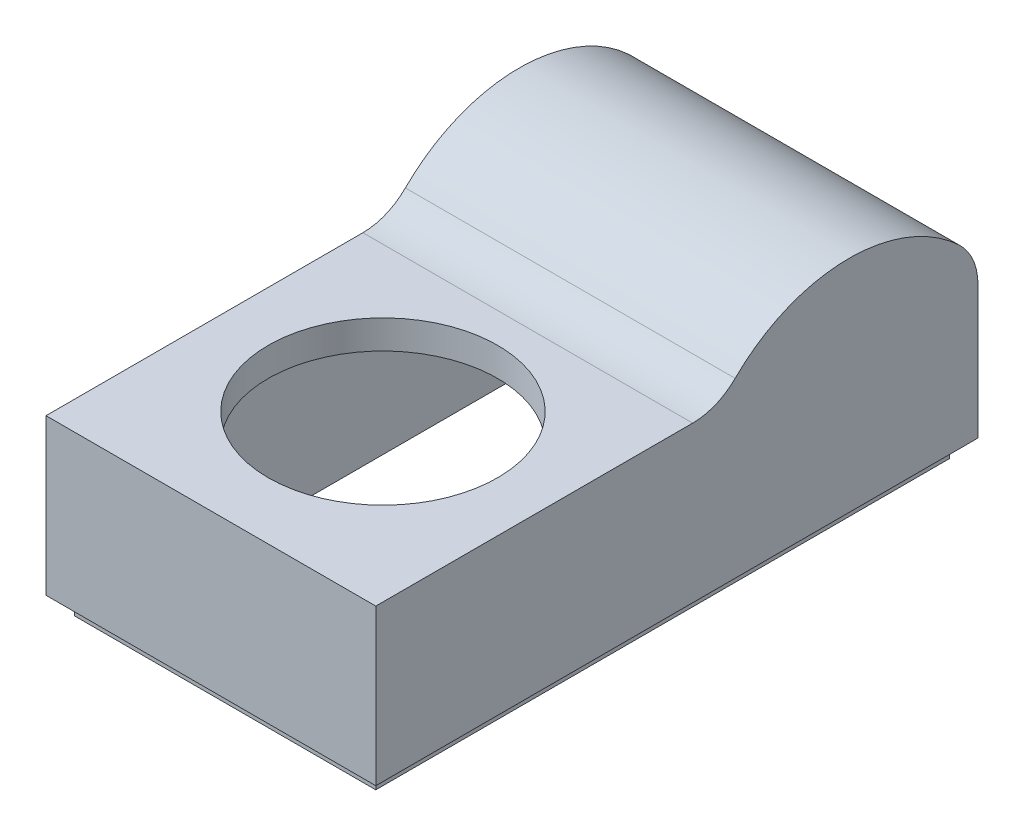
ISO-10303-21;
HEADER;
FILE_DESCRIPTION(('STEP AP214'),'2;1');
FILE_NAME('part.step','',(''),(''),'','','');
FILE_SCHEMA(('AUTOMOTIVE_DESIGN { 1 0 10303 214 1 1 1 1 }'));
ENDSEC;
DATA;
#1=APPLICATION_CONTEXT('core data for automotive mechanical design processes');
#2=APPLICATION_PROTOCOL_DEFINITION('international standard','automotive_design',2000,#1);
#3=PRODUCT_CONTEXT('',#1,'mechanical');
#4=PRODUCT('Part','Part','',(#3));
#5=PRODUCT_RELATED_PRODUCT_CATEGORY('part','',(#4));
#6=PRODUCT_DEFINITION_FORMATION('','',#4);
#7=PRODUCT_DEFINITION_CONTEXT('part definition',#1,'design');
#8=PRODUCT_DEFINITION('design','',#6,#7);
#9=PRODUCT_DEFINITION_SHAPE('','',#8);
#10=(LENGTH_UNIT() NAMED_UNIT(*) SI_UNIT(.MILLI.,.METRE.));
#11=(NAMED_UNIT(*) PLANE_ANGLE_UNIT() SI_UNIT($,.RADIAN.));
#12=(NAMED_UNIT(*) SI_UNIT($,.STERADIAN.) SOLID_ANGLE_UNIT());
#13=UNCERTAINTY_MEASURE_WITH_UNIT(LENGTH_MEASURE(1.E-05),#10,'distance_accuracy_value','');
#14=(GEOMETRIC_REPRESENTATION_CONTEXT(3) GLOBAL_UNCERTAINTY_ASSIGNED_CONTEXT((#13)) GLOBAL_UNIT_ASSIGNED_CONTEXT((#10,
#11,#12)) REPRESENTATION_CONTEXT('',''));
#15=CARTESIAN_POINT('',(0.,0.,0.));
#16=DIRECTION('',(0.,0.,1.));
#17=DIRECTION('',(1.,0.,0.));
#18=AXIS2_PLACEMENT_3D('',#15,#16,#17);
#19=CARTESIAN_POINT('',(0.,-9.74725,0.));
#20=DIRECTION('',(0.,1.,0.));
#21=DIRECTION('',(0.,0.,1.));
#22=AXIS2_PLACEMENT_3D('',#19,#20,#21);
#23=PLANE('',#22);
#24=DIRECTION('',(1.,0.,0.));
#25=VECTOR('',#24,1.);
#26=CARTESIAN_POINT('',(-13.335,-9.74725,-25.4));
#27=LINE('',#26,#25);
#28=CARTESIAN_POINT('',(-13.335,-9.74725,-25.4));
#29=VERTEX_POINT('',#28);
#30=CARTESIAN_POINT('',(-5.39750000000001,-9.74725,-25.4));
#31=VERTEX_POINT('',#30);
#32=EDGE_CURVE('E49',#29,#31,#27,.T.);
#33=ORIENTED_EDGE('',*,*,#32,.F.);
#34=DIRECTION('',(0.,0.,-1.));
#35=VECTOR('',#34,1.);
#36=CARTESIAN_POINT('',(-13.335,-9.74725,25.4));
#37=LINE('',#36,#35);
#38=CARTESIAN_POINT('',(-13.335,-9.74725,25.4));
#39=VERTEX_POINT('',#38);
#40=EDGE_CURVE('E53',#39,#29,#37,.T.);
#41=ORIENTED_EDGE('',*,*,#40,.F.);
#42=DIRECTION('',(-1.,0.,0.));
#43=VECTOR('',#42,1.);
#44=CARTESIAN_POINT('',(13.335,-9.74725,25.4));
#45=LINE('',#44,#43);
#46=CARTESIAN_POINT('',(13.335,-9.74725,25.4));
#47=VERTEX_POINT('',#46);
#48=EDGE_CURVE('E251',#47,#39,#45,.T.);
#49=ORIENTED_EDGE('',*,*,#48,.F.);
#50=DIRECTION('',(0.,0.,1.));
#51=VECTOR('',#50,1.);
#52=CARTESIAN_POINT('',(13.335,-9.74725,-25.4));
#53=LINE('',#52,#51);
#54=CARTESIAN_POINT('',(13.335,-9.74725,-25.4));
#55=VERTEX_POINT('',#54);
#56=EDGE_CURVE('E248',#55,#47,#53,.T.);
#57=ORIENTED_EDGE('',*,*,#56,.F.);
#58=DIRECTION('',(1.,0.,0.));
#59=VECTOR('',#58,1.);
#60=CARTESIAN_POINT('',(5.3975,-9.74725,-25.4));
#61=LINE('',#60,#59);
#62=CARTESIAN_POINT('',(5.39749999999999,-9.74725,-25.4));
#63=VERTEX_POINT('',#62);
#64=EDGE_CURVE('E245',#63,#55,#61,.T.);
#65=ORIENTED_EDGE('',*,*,#64,.F.);
#66=DIRECTION('',(0.,0.,-1.));
#67=VECTOR('',#66,1.);
#68=CARTESIAN_POINT('',(5.3975,-9.74725,-13.2188964238259));
#69=LINE('',#68,#67);
#70=CARTESIAN_POINT('',(5.39749999999999,-9.74725,-26.67));
#71=VERTEX_POINT('',#70);
#72=EDGE_CURVE('E280',#63,#71,#69,.T.);
#73=ORIENTED_EDGE('',*,*,#72,.T.);
#74=DIRECTION('',(-1.,0.,0.));
#75=VECTOR('',#74,1.);
#76=CARTESIAN_POINT('',(-14.605,-9.74725,-26.67));
#77=LINE('',#76,#75);
#78=CARTESIAN_POINT('',(14.605,-9.74725,-26.67));
#79=VERTEX_POINT('',#78);
#80=EDGE_CURVE('E351',#79,#71,#77,.T.);
#81=ORIENTED_EDGE('',*,*,#80,.F.);
#82=DIRECTION('',(0.,0.,-1.));
#83=VECTOR('',#82,1.);
#84=CARTESIAN_POINT('',(14.605,-9.74725,-26.67));
#85=LINE('',#84,#83);
#86=CARTESIAN_POINT('',(14.605,-9.74725,26.67));
#87=VERTEX_POINT('',#86);
#88=EDGE_CURVE('E347',#87,#79,#85,.T.);
#89=ORIENTED_EDGE('',*,*,#88,.F.);
#90=DIRECTION('',(1.,0.,0.));
#91=VECTOR('',#90,1.);
#92=CARTESIAN_POINT('',(-14.605,-9.74725,26.67));
#93=LINE('',#92,#91);
#94=CARTESIAN_POINT('',(-14.605,-9.74725,26.67));
#95=VERTEX_POINT('',#94);
#96=EDGE_CURVE('E344',#95,#87,#93,.T.);
#97=ORIENTED_EDGE('',*,*,#96,.F.);
#98=DIRECTION('',(0.,0.,1.));
#99=VECTOR('',#98,1.);
#100=CARTESIAN_POINT('',(-14.605,-9.74725,-26.67));
#101=LINE('',#100,#99);
#102=CARTESIAN_POINT('',(-14.605,-9.74725,-26.67));
#103=VERTEX_POINT('',#102);
#104=EDGE_CURVE('E341',#103,#95,#101,.T.);
#105=ORIENTED_EDGE('',*,*,#104,.F.);
#106=CARTESIAN_POINT('',(-5.39750000000001,-9.74725,-26.67));
#107=VERTEX_POINT('',#106);
#108=EDGE_CURVE('E350',#107,#103,#77,.T.);
#109=ORIENTED_EDGE('',*,*,#108,.F.);
#110=DIRECTION('',(0.,0.,-1.));
#111=VECTOR('',#110,1.);
#112=CARTESIAN_POINT('',(-5.3975,-9.74725,-13.2188964238259));
#113=LINE('',#112,#111);
#114=EDGE_CURVE('E203',#31,#107,#113,.T.);
#115=ORIENTED_EDGE('',*,*,#114,.F.);
#116=EDGE_LOOP('',(#33,#41,#49,#57,#65,#73,#81,#89,#97,#105,#109,#115));
#117=FACE_BOUND('',#116,.T.);
#118=ADVANCED_FACE('F33',(#117),#23,.F.);
#119=CARTESIAN_POINT('',(-14.605,9.74725,-26.67));
#120=DIRECTION('',(1.,0.,0.));
#121=DIRECTION('',(0.,0.,-1.));
#122=AXIS2_PLACEMENT_3D('',#119,#120,#121);
#123=PLANE('',#122);
#124=CARTESIAN_POINT('',(-14.605,-4.54025,-15.24));
#125=DIRECTION('',(1.,0.,0.));
#126=DIRECTION('',(0.,0.,-1.));
#127=AXIS2_PLACEMENT_3D('',#124,#125,#126);
#128=CIRCLE('',#127,14.2875);
#129=CARTESIAN_POINT('',(-14.605,5.92422779171324,-24.9676595744681));
#130=VERTEX_POINT('',#129);
#131=CARTESIAN_POINT('',(-14.605,5.58584223300971,-5.16056984058223));
#132=VERTEX_POINT('',#131);
#133=EDGE_CURVE('E332',#130,#132,#128,.T.);
#134=ORIENTED_EDGE('',*,*,#133,.F.);
#135=CARTESIAN_POINT('',(-14.605,2.0174894161403,-21.336));
#136=DIRECTION('',(1.,0.,0.));
#137=DIRECTION('',(0.,0.,-1.));
#138=AXIS2_PLACEMENT_3D('',#135,#136,#137);
#139=CIRCLE('',#138,5.334);
#140=CARTESIAN_POINT('',(-14.605,2.0174894161403,-26.67));
#141=VERTEX_POINT('',#140);
#142=EDGE_CURVE('E11',#130,#141,#139,.F.);
#143=ORIENTED_EDGE('',*,*,#142,.T.);
#144=DIRECTION('',(0.,-1.,0.));
#145=VECTOR('',#144,1.);
#146=CARTESIAN_POINT('',(-14.605,9.74725,-26.67));
#147=LINE('',#146,#145);
#148=EDGE_CURVE('E354',#141,#103,#147,.T.);
#149=ORIENTED_EDGE('',*,*,#148,.T.);
#150=ORIENTED_EDGE('',*,*,#104,.T.);
#151=DIRECTION('',(0.,-1.,0.));
#152=VECTOR('',#151,1.);
#153=CARTESIAN_POINT('',(-14.605,9.74725,26.67));
#154=LINE('',#153,#152);
#155=CARTESIAN_POINT('',(-14.605,4.03225,26.67));
#156=VERTEX_POINT('',#155);
#157=EDGE_CURVE('E361',#156,#95,#154,.T.);
#158=ORIENTED_EDGE('',*,*,#157,.F.);
#159=DIRECTION('',(0.,0.,1.));
#160=VECTOR('',#159,1.);
#161=CARTESIAN_POINT('',(-14.605,4.03225,0.));
#162=LINE('',#161,#160);
#163=CARTESIAN_POINT('',(-14.605,4.03225,-1.39758258106627));
#164=VERTEX_POINT('',#163);
#165=EDGE_CURVE('E330',#164,#156,#162,.T.);
#166=ORIENTED_EDGE('',*,*,#165,.F.);
#167=CARTESIAN_POINT('',(-14.605,9.36625,-1.39758258106627));
#168=DIRECTION('',(1.,0.,0.));
#169=DIRECTION('',(0.,0.,-1.));
#170=AXIS2_PLACEMENT_3D('',#167,#168,#169);
#171=CIRCLE('',#170,5.334);
#172=EDGE_CURVE('E370',#164,#132,#171,.T.);
#173=ORIENTED_EDGE('',*,*,#172,.T.);
#174=EDGE_LOOP('',(#134,#143,#149,#150,#158,#166,#173));
#175=FACE_BOUND('',#174,.T.);
#176=ADVANCED_FACE('F386',(#175),#123,.F.);
#177=CARTESIAN_POINT('',(14.605,9.74725,-26.67));
#178=DIRECTION('',(-1.,0.,0.));
#179=DIRECTION('',(0.,0.,1.));
#180=AXIS2_PLACEMENT_3D('',#177,#178,#179);
#181=PLANE('',#180);
#182=DIRECTION('',(0.,-1.,0.));
#183=VECTOR('',#182,1.);
#184=CARTESIAN_POINT('',(14.605,9.74725,-26.67));
#185=LINE('',#184,#183);
#186=CARTESIAN_POINT('',(14.605,2.0174894161403,-26.67));
#187=VERTEX_POINT('',#186);
#188=EDGE_CURVE('E357',#187,#79,#185,.T.);
#189=ORIENTED_EDGE('',*,*,#188,.F.);
#190=CARTESIAN_POINT('',(14.605,2.0174894161403,-21.336));
#191=DIRECTION('',(-1.,0.,0.));
#192=DIRECTION('',(0.,0.,1.));
#193=AXIS2_PLACEMENT_3D('',#190,#191,#192);
#194=CIRCLE('',#193,5.334);
#195=CARTESIAN_POINT('',(14.605,5.92422779171324,-24.9676595744681));
#196=VERTEX_POINT('',#195);
#197=EDGE_CURVE('E376',#187,#196,#194,.F.);
#198=ORIENTED_EDGE('',*,*,#197,.T.);
#199=CARTESIAN_POINT('',(14.605,-4.54025,-15.24));
#200=DIRECTION('',(1.,0.,0.));
#201=DIRECTION('',(0.,0.,-1.));
#202=AXIS2_PLACEMENT_3D('',#199,#200,#201);
#203=CIRCLE('',#202,14.2875);
#204=CARTESIAN_POINT('',(14.605,5.58584223300971,-5.16056984058224));
#205=VERTEX_POINT('',#204);
#206=EDGE_CURVE('E336',#205,#196,#203,.F.);
#207=ORIENTED_EDGE('',*,*,#206,.F.);
#208=CARTESIAN_POINT('',(14.605,9.36625,-1.39758258106627));
#209=DIRECTION('',(-1.,0.,0.));
#210=DIRECTION('',(0.,0.,1.));
#211=AXIS2_PLACEMENT_3D('',#208,#209,#210);
#212=CIRCLE('',#211,5.334);
#213=CARTESIAN_POINT('',(14.605,4.03225,-1.39758258106627));
#214=VERTEX_POINT('',#213);
#215=EDGE_CURVE('E368',#205,#214,#212,.T.);
#216=ORIENTED_EDGE('',*,*,#215,.T.);
#217=DIRECTION('',(0.,0.,-1.));
#218=VECTOR('',#217,1.);
#219=CARTESIAN_POINT('',(14.605,4.03225,0.));
#220=LINE('',#219,#218);
#221=CARTESIAN_POINT('',(14.605,4.03225,26.67));
#222=VERTEX_POINT('',#221);
#223=EDGE_CURVE('E296',#222,#214,#220,.T.);
#224=ORIENTED_EDGE('',*,*,#223,.F.);
#225=DIRECTION('',(0.,-1.,0.));
#226=VECTOR('',#225,1.);
#227=CARTESIAN_POINT('',(14.605,9.74725,26.67));
#228=LINE('',#227,#226);
#229=EDGE_CURVE('E359',#222,#87,#228,.T.);
#230=ORIENTED_EDGE('',*,*,#229,.T.);
#231=ORIENTED_EDGE('',*,*,#88,.T.);
#232=EDGE_LOOP('',(#189,#198,#207,#216,#224,#230,#231));
#233=FACE_BOUND('',#232,.T.);
#234=ADVANCED_FACE('F397',(#233),#181,.F.);
#235=CARTESIAN_POINT('',(-14.605,9.74725,26.67));
#236=DIRECTION('',(0.,0.,-1.));
#237=DIRECTION('',(-1.,0.,0.));
#238=AXIS2_PLACEMENT_3D('',#235,#236,#237);
#239=PLANE('',#238);
#240=ORIENTED_EDGE('',*,*,#229,.F.);
#241=DIRECTION('',(1.,0.,0.));
#242=VECTOR('',#241,1.);
#243=CARTESIAN_POINT('',(-56.9028643077875,4.03225,26.67));
#244=LINE('',#243,#242);
#245=EDGE_CURVE('E333',#156,#222,#244,.T.);
#246=ORIENTED_EDGE('',*,*,#245,.F.);
#247=ORIENTED_EDGE('',*,*,#157,.T.);
#248=ORIENTED_EDGE('',*,*,#96,.T.);
#249=EDGE_LOOP('',(#240,#246,#247,#248));
#250=FACE_BOUND('',#249,.T.);
#251=ADVANCED_FACE('F418',(#250),#239,.F.);
#252=CARTESIAN_POINT('',(-14.605,9.74725,-26.67));
#253=DIRECTION('',(0.,0.,1.));
#254=DIRECTION('',(1.,0.,0.));
#255=AXIS2_PLACEMENT_3D('',#252,#253,#254);
#256=PLANE('',#255);
#257=DIRECTION('',(1.,0.,0.));
#258=VECTOR('',#257,1.);
#259=CARTESIAN_POINT('',(5.39749999999999,-8.15975,-26.67));
#260=LINE('',#259,#258);
#261=CARTESIAN_POINT('',(-5.39750000000001,-8.15975,-26.67));
#262=VERTEX_POINT('',#261);
#263=CARTESIAN_POINT('',(5.39749999999999,-8.15975,-26.67));
#264=VERTEX_POINT('',#263);
#265=EDGE_CURVE('E271',#262,#264,#260,.T.);
#266=ORIENTED_EDGE('',*,*,#265,.F.);
#267=DIRECTION('',(0.,1.,0.));
#268=VECTOR('',#267,1.);
#269=CARTESIAN_POINT('',(-5.39750000000001,-9.74725,-26.67));
#270=LINE('',#269,#268);
#271=EDGE_CURVE('E274',#107,#262,#270,.T.);
#272=ORIENTED_EDGE('',*,*,#271,.F.);
#273=ORIENTED_EDGE('',*,*,#108,.T.);
#274=ORIENTED_EDGE('',*,*,#148,.F.);
#275=DIRECTION('',(1.,0.,0.));
#276=VECTOR('',#275,1.);
#277=CARTESIAN_POINT('',(-14.605,2.0174894161403,-26.67));
#278=LINE('',#277,#276);
#279=EDGE_CURVE('E373',#141,#187,#278,.T.);
#280=ORIENTED_EDGE('',*,*,#279,.T.);
#281=ORIENTED_EDGE('',*,*,#188,.T.);
#282=ORIENTED_EDGE('',*,*,#80,.T.);
#283=DIRECTION('',(0.,-1.,0.));
#284=VECTOR('',#283,1.);
#285=CARTESIAN_POINT('',(5.39749999999999,-9.74725,-26.67));
#286=LINE('',#285,#284);
#287=EDGE_CURVE('E270',#264,#71,#286,.T.);
#288=ORIENTED_EDGE('',*,*,#287,.F.);
#289=EDGE_LOOP('',(#266,#272,#273,#274,#280,#281,#282,#288));
#290=FACE_BOUND('',#289,.T.);
#291=ADVANCED_FACE('F395',(#290),#256,.F.);
#292=CARTESIAN_POINT('',(-56.9028643077875,4.03225,0.));
#293=DIRECTION('',(0.,-1.,0.));
#294=DIRECTION('',(0.,0.,-1.));
#295=AXIS2_PLACEMENT_3D('',#292,#293,#294);
#296=PLANE('',#295);
#297=CARTESIAN_POINT('',(0.,4.03225,11.43));
#298=DIRECTION('',(0.,1.,0.));
#299=DIRECTION('',(0.,0.,1.));
#300=AXIS2_PLACEMENT_3D('',#297,#298,#299);
#301=CIRCLE('',#300,10.16);
#302=CARTESIAN_POINT('',(0.,4.03225,21.59));
#303=VERTEX_POINT('',#302);
#304=EDGE_CURVE('E288',#303,#303,#301,.T.);
#305=ORIENTED_EDGE('',*,*,#304,.F.);
#306=EDGE_LOOP('',(#305));
#307=FACE_BOUND('',#306,.T.);
#308=ORIENTED_EDGE('',*,*,#223,.T.);
#309=DIRECTION('',(-1.,0.,0.));
#310=VECTOR('',#309,1.);
#311=CARTESIAN_POINT('',(-14.605,4.03225,-1.39758258106627));
#312=LINE('',#311,#310);
#313=EDGE_CURVE('E366',#214,#164,#312,.T.);
#314=ORIENTED_EDGE('',*,*,#313,.T.);
#315=ORIENTED_EDGE('',*,*,#165,.T.);
#316=ORIENTED_EDGE('',*,*,#245,.T.);
#317=EDGE_LOOP('',(#308,#314,#315,#316));
#318=FACE_BOUND('',#317,.T.);
#319=ADVANCED_FACE('F420',(#307,#318),#296,.F.);
#320=CARTESIAN_POINT('',(-56.9028643077875,-4.54025,-15.24));
#321=DIRECTION('',(1.,0.,0.));
#322=DIRECTION('',(0.,0.,-1.));
#323=AXIS2_PLACEMENT_3D('',#320,#321,#322);
#324=CYLINDRICAL_SURFACE('',#323,14.2875);
#325=ORIENTED_EDGE('',*,*,#206,.T.);
#326=DIRECTION('',(1.,0.,0.));
#327=VECTOR('',#326,1.);
#328=CARTESIAN_POINT('',(-56.9028643077875,5.92422779171324,-24.9676595744681));
#329=LINE('',#328,#327);
#330=EDGE_CURVE('E42',#196,#130,#329,.F.);
#331=ORIENTED_EDGE('',*,*,#330,.T.);
#332=ORIENTED_EDGE('',*,*,#133,.T.);
#333=DIRECTION('',(1.,0.,0.));
#334=VECTOR('',#333,1.);
#335=CARTESIAN_POINT('',(-56.9028643077875,5.58584223300971,-5.16056984058222));
#336=LINE('',#335,#334);
#337=EDGE_CURVE('E363',#132,#205,#336,.T.);
#338=ORIENTED_EDGE('',*,*,#337,.T.);
#339=EDGE_LOOP('',(#325,#331,#332,#338));
#340=FACE_BOUND('',#339,.T.);
#341=ADVANCED_FACE('F381',(#340),#324,.T.);
#342=CARTESIAN_POINT('',(-56.9028643077875,9.36625,-1.39758258106626));
#343=DIRECTION('',(1.,0.,0.));
#344=DIRECTION('',(0.,0.,-1.));
#345=AXIS2_PLACEMENT_3D('',#342,#343,#344);
#346=CYLINDRICAL_SURFACE('',#345,5.334);
#347=ORIENTED_EDGE('',*,*,#172,.F.);
#348=ORIENTED_EDGE('',*,*,#313,.F.);
#349=ORIENTED_EDGE('',*,*,#215,.F.);
#350=ORIENTED_EDGE('',*,*,#337,.F.);
#351=EDGE_LOOP('',(#347,#348,#349,#350));
#352=FACE_BOUND('',#351,.T.);
#353=ADVANCED_FACE('F423',(#352),#346,.F.);
#354=CARTESIAN_POINT('',(-56.9028643077875,2.0174894161403,-21.336));
#355=DIRECTION('',(1.,0.,0.));
#356=DIRECTION('',(0.,0.,-1.));
#357=AXIS2_PLACEMENT_3D('',#354,#355,#356);
#358=CYLINDRICAL_SURFACE('',#357,5.334);
#359=ORIENTED_EDGE('',*,*,#142,.F.);
#360=ORIENTED_EDGE('',*,*,#330,.F.);
#361=ORIENTED_EDGE('',*,*,#197,.F.);
#362=ORIENTED_EDGE('',*,*,#279,.F.);
#363=EDGE_LOOP('',(#359,#360,#361,#362));
#364=FACE_BOUND('',#363,.T.);
#365=ADVANCED_FACE('F35',(#364),#358,.T.);
#366=CARTESIAN_POINT('',(-12.065,9.74725,-26.67));
#367=DIRECTION('',(1.,0.,0.));
#368=DIRECTION('',(0.,0.,-1.));
#369=AXIS2_PLACEMENT_3D('',#366,#367,#368);
#370=PLANE('',#369);
#371=CARTESIAN_POINT('',(-12.065,-4.54025,-15.24));
#372=DIRECTION('',(1.,0.,0.));
#373=DIRECTION('',(0.,0.,-1.));
#374=AXIS2_PLACEMENT_3D('',#371,#372,#373);
#375=CIRCLE('',#374,11.7475);
#376=CARTESIAN_POINT('',(-12.065,4.06387618429755,-23.2382978723404));
#377=VERTEX_POINT('',#376);
#378=CARTESIAN_POINT('',(-12.065,3.78564805825243,-6.95246853558983));
#379=VERTEX_POINT('',#378);
#380=EDGE_CURVE('E291',#377,#379,#375,.T.);
#381=ORIENTED_EDGE('',*,*,#380,.T.);
#382=CARTESIAN_POINT('',(-12.065,9.36625,-1.39758258106627));
#383=DIRECTION('',(1.,0.,0.));
#384=DIRECTION('',(0.,0.,-1.));
#385=AXIS2_PLACEMENT_3D('',#382,#383,#384);
#386=CIRCLE('',#385,7.874);
#387=CARTESIAN_POINT('',(-12.065,1.49225,-1.39758258106627));
#388=VERTEX_POINT('',#387);
#389=EDGE_CURVE('E306',#388,#379,#386,.T.);
#390=ORIENTED_EDGE('',*,*,#389,.F.);
#391=DIRECTION('',(0.,0.,1.));
#392=VECTOR('',#391,1.);
#393=CARTESIAN_POINT('',(-12.065,1.49225,0.));
#394=LINE('',#393,#392);
#395=CARTESIAN_POINT('',(-12.065,1.49225,24.13));
#396=VERTEX_POINT('',#395);
#397=EDGE_CURVE('E293',#388,#396,#394,.T.);
#398=ORIENTED_EDGE('',*,*,#397,.T.);
#399=DIRECTION('',(0.,-1.,0.));
#400=VECTOR('',#399,1.);
#401=CARTESIAN_POINT('',(-12.065,9.74725,24.13));
#402=LINE('',#401,#400);
#403=CARTESIAN_POINT('',(-12.065,-11.33475,24.13));
#404=VERTEX_POINT('',#403);
#405=EDGE_CURVE('E300',#396,#404,#402,.T.);
#406=ORIENTED_EDGE('',*,*,#405,.T.);
#407=DIRECTION('',(0.,0.,1.));
#408=VECTOR('',#407,1.);
#409=CARTESIAN_POINT('',(-12.065,-11.33475,-24.13));
#410=LINE('',#409,#408);
#411=CARTESIAN_POINT('',(-12.065,-11.33475,-24.13));
#412=VERTEX_POINT('',#411);
#413=EDGE_CURVE('E214',#412,#404,#410,.T.);
#414=ORIENTED_EDGE('',*,*,#413,.F.);
#415=DIRECTION('',(0.,-1.,0.));
#416=VECTOR('',#415,1.);
#417=CARTESIAN_POINT('',(-12.065,9.74725,-24.13));
#418=LINE('',#417,#416);
#419=CARTESIAN_POINT('',(-12.065,2.0174894161403,-24.13));
#420=VERTEX_POINT('',#419);
#421=EDGE_CURVE('E210',#420,#412,#418,.T.);
#422=ORIENTED_EDGE('',*,*,#421,.F.);
#423=CARTESIAN_POINT('',(-12.065,2.0174894161403,-21.336));
#424=DIRECTION('',(1.,0.,0.));
#425=DIRECTION('',(0.,0.,-1.));
#426=AXIS2_PLACEMENT_3D('',#423,#424,#425);
#427=CIRCLE('',#426,2.794);
#428=EDGE_CURVE('E294',#377,#420,#427,.F.);
#429=ORIENTED_EDGE('',*,*,#428,.F.);
#430=EDGE_LOOP('',(#381,#390,#398,#406,#414,#422,#429));
#431=FACE_BOUND('',#430,.T.);
#432=ADVANCED_FACE('F429',(#431),#370,.T.);
#433=CARTESIAN_POINT('',(12.065,9.74725,-26.67));
#434=DIRECTION('',(-1.,0.,0.));
#435=DIRECTION('',(0.,0.,1.));
#436=AXIS2_PLACEMENT_3D('',#433,#434,#435);
#437=PLANE('',#436);
#438=DIRECTION('',(0.,-1.,0.));
#439=VECTOR('',#438,1.);
#440=CARTESIAN_POINT('',(12.065,9.74725,-24.13));
#441=LINE('',#440,#439);
#442=CARTESIAN_POINT('',(12.065,2.0174894161403,-24.13));
#443=VERTEX_POINT('',#442);
#444=CARTESIAN_POINT('',(12.065,-11.33475,-24.13));
#445=VERTEX_POINT('',#444);
#446=EDGE_CURVE('E299',#443,#445,#441,.T.);
#447=ORIENTED_EDGE('',*,*,#446,.T.);
#448=DIRECTION('',(0.,0.,-1.));
#449=VECTOR('',#448,1.);
#450=CARTESIAN_POINT('',(12.065,-11.33475,24.13));
#451=LINE('',#450,#449);
#452=CARTESIAN_POINT('',(12.065,-11.33475,24.13));
#453=VERTEX_POINT('',#452);
#454=EDGE_CURVE('E227',#453,#445,#451,.T.);
#455=ORIENTED_EDGE('',*,*,#454,.F.);
#456=DIRECTION('',(0.,-1.,0.));
#457=VECTOR('',#456,1.);
#458=CARTESIAN_POINT('',(12.065,9.74725,24.13));
#459=LINE('',#458,#457);
#460=CARTESIAN_POINT('',(12.065,1.49225,24.13));
#461=VERTEX_POINT('',#460);
#462=EDGE_CURVE('E303',#461,#453,#459,.T.);
#463=ORIENTED_EDGE('',*,*,#462,.F.);
#464=DIRECTION('',(0.,0.,-1.));
#465=VECTOR('',#464,1.);
#466=CARTESIAN_POINT('',(12.065,1.49225,0.));
#467=LINE('',#466,#465);
#468=CARTESIAN_POINT('',(12.065,1.49225,-1.39758258106627));
#469=VERTEX_POINT('',#468);
#470=EDGE_CURVE('E319',#461,#469,#467,.T.);
#471=ORIENTED_EDGE('',*,*,#470,.T.);
#472=CARTESIAN_POINT('',(12.065,9.36625,-1.39758258106627));
#473=DIRECTION('',(-1.,0.,0.));
#474=DIRECTION('',(0.,0.,1.));
#475=AXIS2_PLACEMENT_3D('',#472,#473,#474);
#476=CIRCLE('',#475,7.874);
#477=CARTESIAN_POINT('',(12.065,3.78564805825243,-6.95246853558984));
#478=VERTEX_POINT('',#477);
#479=EDGE_CURVE('E310',#478,#469,#476,.T.);
#480=ORIENTED_EDGE('',*,*,#479,.F.);
#481=CARTESIAN_POINT('',(12.065,-4.54025,-15.24));
#482=DIRECTION('',(-1.,0.,0.));
#483=DIRECTION('',(0.,0.,1.));
#484=AXIS2_PLACEMENT_3D('',#481,#482,#483);
#485=CIRCLE('',#484,11.7475);
#486=CARTESIAN_POINT('',(12.065,4.06387618429755,-23.2382978723404));
#487=VERTEX_POINT('',#486);
#488=EDGE_CURVE('E313',#478,#487,#485,.T.);
#489=ORIENTED_EDGE('',*,*,#488,.T.);
#490=CARTESIAN_POINT('',(12.065,2.0174894161403,-21.336));
#491=DIRECTION('',(-1.,0.,0.));
#492=DIRECTION('',(0.,0.,1.));
#493=AXIS2_PLACEMENT_3D('',#490,#491,#492);
#494=CIRCLE('',#493,2.794);
#495=EDGE_CURVE('E315',#443,#487,#494,.F.);
#496=ORIENTED_EDGE('',*,*,#495,.F.);
#497=EDGE_LOOP('',(#447,#455,#463,#471,#480,#489,#496));
#498=FACE_BOUND('',#497,.T.);
#499=ADVANCED_FACE('F629',(#498),#437,.T.);
#500=CARTESIAN_POINT('',(-14.605,9.74725,24.13));
#501=DIRECTION('',(0.,0.,-1.));
#502=DIRECTION('',(-1.,0.,0.));
#503=AXIS2_PLACEMENT_3D('',#500,#501,#502);
#504=PLANE('',#503);
#505=ORIENTED_EDGE('',*,*,#462,.T.);
#506=DIRECTION('',(1.,0.,0.));
#507=VECTOR('',#506,1.);
#508=CARTESIAN_POINT('',(-12.065,-11.33475,24.13));
#509=LINE('',#508,#507);
#510=EDGE_CURVE('E224',#404,#453,#509,.T.);
#511=ORIENTED_EDGE('',*,*,#510,.F.);
#512=ORIENTED_EDGE('',*,*,#405,.F.);
#513=DIRECTION('',(1.,0.,0.));
#514=VECTOR('',#513,1.);
#515=CARTESIAN_POINT('',(-56.9028643077875,1.49225,24.13));
#516=LINE('',#515,#514);
#517=EDGE_CURVE('E305',#396,#461,#516,.T.);
#518=ORIENTED_EDGE('',*,*,#517,.T.);
#519=EDGE_LOOP('',(#505,#511,#512,#518));
#520=FACE_BOUND('',#519,.T.);
#521=ADVANCED_FACE('F617',(#520),#504,.T.);
#522=CARTESIAN_POINT('',(-14.605,9.74725,-24.13));
#523=DIRECTION('',(0.,0.,1.));
#524=DIRECTION('',(1.,0.,0.));
#525=AXIS2_PLACEMENT_3D('',#522,#523,#524);
#526=PLANE('',#525);
#527=DIRECTION('',(0.,1.,0.));
#528=VECTOR('',#527,1.);
#529=CARTESIAN_POINT('',(-5.39750000000001,-9.74725,-24.13));
#530=LINE('',#529,#528);
#531=CARTESIAN_POINT('',(-5.3975,-11.33475,-24.13));
#532=VERTEX_POINT('',#531);
#533=CARTESIAN_POINT('',(-5.39750000000001,-8.15975,-24.13));
#534=VERTEX_POINT('',#533);
#535=EDGE_CURVE('E193',#532,#534,#530,.T.);
#536=ORIENTED_EDGE('',*,*,#535,.T.);
#537=DIRECTION('',(1.,0.,0.));
#538=VECTOR('',#537,1.);
#539=CARTESIAN_POINT('',(5.39749999999999,-8.15975,-24.13));
#540=LINE('',#539,#538);
#541=CARTESIAN_POINT('',(5.3975,-8.15975,-24.13));
#542=VERTEX_POINT('',#541);
#543=EDGE_CURVE('E282',#534,#542,#540,.T.);
#544=ORIENTED_EDGE('',*,*,#543,.T.);
#545=DIRECTION('',(0.,-1.,0.));
#546=VECTOR('',#545,1.);
#547=CARTESIAN_POINT('',(5.39749999999999,-9.74725,-24.13));
#548=LINE('',#547,#546);
#549=CARTESIAN_POINT('',(5.3975,-11.33475,-24.13));
#550=VERTEX_POINT('',#549);
#551=EDGE_CURVE('E278',#542,#550,#548,.T.);
#552=ORIENTED_EDGE('',*,*,#551,.T.);
#553=DIRECTION('',(-1.,0.,0.));
#554=VECTOR('',#553,1.);
#555=CARTESIAN_POINT('',(12.065,-11.33475,-24.13));
#556=LINE('',#555,#554);
#557=EDGE_CURVE('E230',#445,#550,#556,.T.);
#558=ORIENTED_EDGE('',*,*,#557,.F.);
#559=ORIENTED_EDGE('',*,*,#446,.F.);
#560=DIRECTION('',(1.,0.,0.));
#561=VECTOR('',#560,1.);
#562=CARTESIAN_POINT('',(-14.605,2.0174894161403,-24.13));
#563=LINE('',#562,#561);
#564=EDGE_CURVE('E309',#420,#443,#563,.T.);
#565=ORIENTED_EDGE('',*,*,#564,.F.);
#566=ORIENTED_EDGE('',*,*,#421,.T.);
#567=DIRECTION('',(-1.,0.,0.));
#568=VECTOR('',#567,1.);
#569=CARTESIAN_POINT('',(-5.3975,-11.33475,-24.13));
#570=LINE('',#569,#568);
#571=EDGE_CURVE('E206',#532,#412,#570,.T.);
#572=ORIENTED_EDGE('',*,*,#571,.F.);
#573=EDGE_LOOP('',(#536,#544,#552,#558,#559,#565,#566,#572));
#574=FACE_BOUND('',#573,.T.);
#575=ADVANCED_FACE('F207',(#574),#526,.T.);
#576=CARTESIAN_POINT('',(-56.9028643077875,1.49225,0.));
#577=DIRECTION('',(0.,-1.,0.));
#578=DIRECTION('',(0.,0.,-1.));
#579=AXIS2_PLACEMENT_3D('',#576,#577,#578);
#580=PLANE('',#579);
#581=CARTESIAN_POINT('',(0.,1.49225,11.43));
#582=DIRECTION('',(0.,-1.,0.));
#583=DIRECTION('',(0.,0.,-1.));
#584=AXIS2_PLACEMENT_3D('',#581,#582,#583);
#585=CIRCLE('',#584,10.16);
#586=CARTESIAN_POINT('',(0.,1.49225000000001,21.59));
#587=VERTEX_POINT('',#586);
#588=EDGE_CURVE('E37',#587,#587,#585,.T.);
#589=ORIENTED_EDGE('',*,*,#588,.F.);
#590=EDGE_LOOP('',(#589));
#591=FACE_BOUND('',#590,.T.);
#592=ORIENTED_EDGE('',*,*,#470,.F.);
#593=ORIENTED_EDGE('',*,*,#517,.F.);
#594=ORIENTED_EDGE('',*,*,#397,.F.);
#595=DIRECTION('',(1.,0.,0.));
#596=VECTOR('',#595,1.);
#597=CARTESIAN_POINT('',(-56.9028643077875,1.49225,-1.39758258106627));
#598=LINE('',#597,#596);
#599=EDGE_CURVE('E321',#469,#388,#598,.F.);
#600=ORIENTED_EDGE('',*,*,#599,.F.);
#601=EDGE_LOOP('',(#592,#593,#594,#600));
#602=FACE_BOUND('',#601,.T.);
#603=ADVANCED_FACE('F490',(#591,#602),#580,.T.);
#604=CARTESIAN_POINT('',(-56.9028643077875,-4.54025,-15.24));
#605=DIRECTION('',(1.,0.,0.));
#606=DIRECTION('',(0.,0.,-1.));
#607=AXIS2_PLACEMENT_3D('',#604,#605,#606);
#608=CYLINDRICAL_SURFACE('',#607,11.7475);
#609=ORIENTED_EDGE('',*,*,#488,.F.);
#610=DIRECTION('',(1.,0.,0.));
#611=VECTOR('',#610,1.);
#612=CARTESIAN_POINT('',(-56.9028643077875,3.78564805825243,-6.95246853558982));
#613=LINE('',#612,#611);
#614=EDGE_CURVE('E302',#379,#478,#613,.T.);
#615=ORIENTED_EDGE('',*,*,#614,.F.);
#616=ORIENTED_EDGE('',*,*,#380,.F.);
#617=DIRECTION('',(1.,0.,0.));
#618=VECTOR('',#617,1.);
#619=CARTESIAN_POINT('',(-56.9028643077875,4.06387618429755,-23.2382978723404));
#620=LINE('',#619,#618);
#621=EDGE_CURVE('E297',#487,#377,#620,.F.);
#622=ORIENTED_EDGE('',*,*,#621,.F.);
#623=EDGE_LOOP('',(#609,#615,#616,#622));
#624=FACE_BOUND('',#623,.T.);
#625=ADVANCED_FACE('F484',(#624),#608,.F.);
#626=CARTESIAN_POINT('',(-56.9028643077875,9.36625,-1.39758258106626));
#627=DIRECTION('',(1.,0.,0.));
#628=DIRECTION('',(0.,0.,-1.));
#629=AXIS2_PLACEMENT_3D('',#626,#627,#628);
#630=CYLINDRICAL_SURFACE('',#629,7.874);
#631=ORIENTED_EDGE('',*,*,#389,.T.);
#632=ORIENTED_EDGE('',*,*,#614,.T.);
#633=ORIENTED_EDGE('',*,*,#479,.T.);
#634=ORIENTED_EDGE('',*,*,#599,.T.);
#635=EDGE_LOOP('',(#631,#632,#633,#634));
#636=FACE_BOUND('',#635,.T.);
#637=ADVANCED_FACE('F489',(#636),#630,.T.);
#638=CARTESIAN_POINT('',(-56.9028643077875,2.0174894161403,-21.336));
#639=DIRECTION('',(1.,0.,0.));
#640=DIRECTION('',(0.,0.,-1.));
#641=AXIS2_PLACEMENT_3D('',#638,#639,#640);
#642=CYLINDRICAL_SURFACE('',#641,2.794);
#643=ORIENTED_EDGE('',*,*,#428,.T.);
#644=ORIENTED_EDGE('',*,*,#564,.T.);
#645=ORIENTED_EDGE('',*,*,#495,.T.);
#646=ORIENTED_EDGE('',*,*,#621,.T.);
#647=EDGE_LOOP('',(#643,#644,#645,#646));
#648=FACE_BOUND('',#647,.T.);
#649=ADVANCED_FACE('F501',(#648),#642,.F.);
#650=CARTESIAN_POINT('',(0.,-20.09775,11.43));
#651=DIRECTION('',(0.,1.,0.));
#652=DIRECTION('',(0.,0.,1.));
#653=AXIS2_PLACEMENT_3D('',#650,#651,#652);
#654=CYLINDRICAL_SURFACE('',#653,10.16);
#655=CARTESIAN_POINT('',(0.,1.49225000000001,21.59));
#656=CARTESIAN_POINT('',(0.,1.51870833333334,21.59));
#657=CARTESIAN_POINT('',(0.,1.54516666666667,21.59));
#658=CARTESIAN_POINT('',(0.,1.59808333333334,21.59));
#659=CARTESIAN_POINT('',(0.,1.62454166666667,21.59));
#660=CARTESIAN_POINT('',(0.,1.67745833333334,21.59));
#661=CARTESIAN_POINT('',(0.,1.70391666666667,21.59));
#662=CARTESIAN_POINT('',(0.,1.75683333333334,21.59));
#663=CARTESIAN_POINT('',(0.,1.78329166666667,21.59));
#664=CARTESIAN_POINT('',(0.,1.83620833333334,21.59));
#665=CARTESIAN_POINT('',(0.,1.86266666666667,21.59));
#666=CARTESIAN_POINT('',(0.,1.91558333333334,21.59));
#667=CARTESIAN_POINT('',(0.,1.94204166666667,21.59));
#668=CARTESIAN_POINT('',(0.,1.99495833333334,21.59));
#669=CARTESIAN_POINT('',(0.,2.02141666666667,21.59));
#670=CARTESIAN_POINT('',(0.,2.07433333333334,21.59));
#671=CARTESIAN_POINT('',(0.,2.10079166666667,21.59));
#672=CARTESIAN_POINT('',(0.,2.15370833333334,21.59));
#673=CARTESIAN_POINT('',(0.,2.18016666666667,21.59));
#674=CARTESIAN_POINT('',(0.,2.23308333333334,21.59));
#675=CARTESIAN_POINT('',(0.,2.25954166666667,21.59));
#676=CARTESIAN_POINT('',(0.,2.31245833333334,21.59));
#677=CARTESIAN_POINT('',(0.,2.33891666666667,21.59));
#678=CARTESIAN_POINT('',(0.,2.39183333333334,21.59));
#679=CARTESIAN_POINT('',(0.,2.41829166666667,21.59));
#680=CARTESIAN_POINT('',(0.,2.47120833333334,21.59));
#681=CARTESIAN_POINT('',(0.,2.49766666666667,21.59));
#682=CARTESIAN_POINT('',(0.,2.55058333333334,21.59));
#683=CARTESIAN_POINT('',(0.,2.57704166666667,21.59));
#684=CARTESIAN_POINT('',(0.,2.62995833333334,21.59));
#685=CARTESIAN_POINT('',(0.,2.65641666666667,21.59));
#686=CARTESIAN_POINT('',(0.,2.70933333333334,21.59));
#687=CARTESIAN_POINT('',(0.,2.73579166666667,21.59));
#688=CARTESIAN_POINT('',(0.,2.78870833333334,21.59));
#689=CARTESIAN_POINT('',(0.,2.81516666666667,21.59));
#690=CARTESIAN_POINT('',(0.,2.86808333333334,21.59));
#691=CARTESIAN_POINT('',(0.,2.89454166666667,21.59));
#692=CARTESIAN_POINT('',(0.,2.94745833333334,21.59));
#693=CARTESIAN_POINT('',(0.,2.97391666666667,21.59));
#694=CARTESIAN_POINT('',(0.,3.02683333333334,21.59));
#695=CARTESIAN_POINT('',(0.,3.05329166666667,21.59));
#696=CARTESIAN_POINT('',(0.,3.10620833333334,21.59));
#697=CARTESIAN_POINT('',(0.,3.13266666666667,21.59));
#698=CARTESIAN_POINT('',(0.,3.18558333333334,21.59));
#699=CARTESIAN_POINT('',(0.,3.21204166666667,21.59));
#700=CARTESIAN_POINT('',(0.,3.26495833333334,21.59));
#701=CARTESIAN_POINT('',(0.,3.29141666666667,21.59));
#702=CARTESIAN_POINT('',(0.,3.34433333333334,21.59));
#703=CARTESIAN_POINT('',(0.,3.37079166666667,21.59));
#704=CARTESIAN_POINT('',(0.,3.42370833333334,21.59));
#705=CARTESIAN_POINT('',(0.,3.45016666666667,21.59));
#706=CARTESIAN_POINT('',(0.,3.50308333333334,21.59));
#707=CARTESIAN_POINT('',(0.,3.52954166666667,21.59));
#708=CARTESIAN_POINT('',(0.,3.58245833333334,21.59));
#709=CARTESIAN_POINT('',(0.,3.60891666666667,21.59));
#710=CARTESIAN_POINT('',(0.,3.66183333333334,21.59));
#711=CARTESIAN_POINT('',(0.,3.68829166666667,21.59));
#712=CARTESIAN_POINT('',(0.,3.74120833333334,21.59));
#713=CARTESIAN_POINT('',(0.,3.76766666666667,21.59));
#714=CARTESIAN_POINT('',(0.,3.82058333333334,21.59));
#715=CARTESIAN_POINT('',(0.,3.84704166666667,21.59));
#716=CARTESIAN_POINT('',(0.,3.89995833333333,21.59));
#717=CARTESIAN_POINT('',(0.,3.92641666666667,21.59));
#718=CARTESIAN_POINT('',(0.,3.97933333333333,21.59));
#719=CARTESIAN_POINT('',(0.,4.00579166666667,21.59));
#720=CARTESIAN_POINT('',(0.,4.03225,21.59));
#721=B_SPLINE_CURVE_WITH_KNOTS('',3,(#655,#656,#657,#658,#659,#660,#661,#662,#663,#664,#665,
#666,#667,#668,#669,#670,#671,#672,#673,#674,#675,#676,#677,#678,#679,#680,#681,#682,#683,#684,
#685,#686,#687,#688,#689,#690,#691,#692,#693,#694,#695,#696,#697,#698,#699,#700,#701,#702,#703,
#704,#705,#706,#707,#708,#709,#710,#711,#712,#713,#714,#715,#716,#717,#718,#719,#720),
.UNSPECIFIED.,.F.,.F.,(4,2,2,2,2,2,2,2,2,2,2,2,2,2,2,2,2,2,2,2,2,2,2,2,2,2,2,2,2,2,2,2,4),(0.,
0.0793749999999996,0.158749999999999,0.238124999999999,0.317499999999998,0.396874999999998,
0.476249999999998,0.555624999999997,0.634999999999997,0.714375,0.793749999999999,
0.873124999999999,0.952499999999998,1.031875,1.11125,1.190625,1.27,1.349375,1.42875,1.508125,
1.5875,1.66687499999999,1.74624999999999,1.82562499999999,1.905,1.984375,2.06375,2.143125,
2.2225,2.301875,2.38124999999999,2.46062499999999,2.53999999999999),.UNSPECIFIED.);
#722=EDGE_CURVE('BSEAM510',#587,#303,#721,.T.);
#723=ORIENTED_EDGE('',*,*,#588,.T.);
#724=ORIENTED_EDGE('',*,*,#304,.T.);
#725=ORIENTED_EDGE('',*,*,#722,.T.);
#726=ORIENTED_EDGE('',*,*,#722,.F.);
#727=EDGE_LOOP('',(#723,#725,#724,#726));
#728=FACE_BOUND('',#727,.T.);
#729=ADVANCED_FACE('F510',(#728),#654,.F.);
#730=CARTESIAN_POINT('',(-5.3975,-9.74725,-13.2188964238259));
#731=DIRECTION('',(-1.,0.,0.));
#732=DIRECTION('',(0.,0.,1.));
#733=AXIS2_PLACEMENT_3D('',#730,#731,#732);
#734=PLANE('',#733);
#735=ORIENTED_EDGE('',*,*,#535,.F.);
#736=DIRECTION('',(0.,0.,1.));
#737=VECTOR('',#736,1.);
#738=CARTESIAN_POINT('',(-5.3975,-11.33475,-25.4));
#739=LINE('',#738,#737);
#740=CARTESIAN_POINT('',(-5.3975,-11.33475,-25.4));
#741=VERTEX_POINT('',#740);
#742=EDGE_CURVE('E198',#741,#532,#739,.T.);
#743=ORIENTED_EDGE('',*,*,#742,.F.);
#744=DIRECTION('',(0.,1.,0.));
#745=VECTOR('',#744,1.);
#746=CARTESIAN_POINT('',(-5.3975,-11.33475,-25.4));
#747=LINE('',#746,#745);
#748=EDGE_CURVE('E244',#741,#31,#747,.T.);
#749=ORIENTED_EDGE('',*,*,#748,.T.);
#750=ORIENTED_EDGE('',*,*,#114,.T.);
#751=ORIENTED_EDGE('',*,*,#271,.T.);
#752=DIRECTION('',(0.,0.,-1.));
#753=VECTOR('',#752,1.);
#754=CARTESIAN_POINT('',(-5.3975,-8.15975,-13.2188964238259));
#755=LINE('',#754,#753);
#756=EDGE_CURVE('E200',#534,#262,#755,.T.);
#757=ORIENTED_EDGE('',*,*,#756,.F.);
#758=EDGE_LOOP('',(#735,#743,#749,#750,#751,#757));
#759=FACE_BOUND('',#758,.T.);
#760=ADVANCED_FACE('F195',(#759),#734,.F.);
#761=CARTESIAN_POINT('',(5.3975,-8.15975,-13.2188964238259));
#762=DIRECTION('',(0.,1.,0.));
#763=DIRECTION('',(0.,0.,1.));
#764=AXIS2_PLACEMENT_3D('',#761,#762,#763);
#765=PLANE('',#764);
#766=ORIENTED_EDGE('',*,*,#756,.T.);
#767=ORIENTED_EDGE('',*,*,#265,.T.);
#768=DIRECTION('',(0.,0.,-1.));
#769=VECTOR('',#768,1.);
#770=CARTESIAN_POINT('',(5.3975,-8.15975,-13.2188964238259));
#771=LINE('',#770,#769);
#772=EDGE_CURVE('E281',#542,#264,#771,.T.);
#773=ORIENTED_EDGE('',*,*,#772,.F.);
#774=ORIENTED_EDGE('',*,*,#543,.F.);
#775=EDGE_LOOP('',(#766,#767,#773,#774));
#776=FACE_BOUND('',#775,.T.);
#777=ADVANCED_FACE('F412',(#776),#765,.F.);
#778=CARTESIAN_POINT('',(5.3975,-9.74725,-13.2188964238259));
#779=DIRECTION('',(1.,0.,0.));
#780=DIRECTION('',(0.,0.,-1.));
#781=AXIS2_PLACEMENT_3D('',#778,#779,#780);
#782=PLANE('',#781);
#783=ORIENTED_EDGE('',*,*,#772,.T.);
#784=ORIENTED_EDGE('',*,*,#287,.T.);
#785=ORIENTED_EDGE('',*,*,#72,.F.);
#786=DIRECTION('',(0.,1.,0.));
#787=VECTOR('',#786,1.);
#788=CARTESIAN_POINT('',(5.3975,-11.33475,-25.4));
#789=LINE('',#788,#787);
#790=CARTESIAN_POINT('',(5.3975,-11.33475,-25.4));
#791=VERTEX_POINT('',#790);
#792=EDGE_CURVE('E267',#791,#63,#789,.T.);
#793=ORIENTED_EDGE('',*,*,#792,.F.);
#794=DIRECTION('',(0.,0.,-1.));
#795=VECTOR('',#794,1.);
#796=CARTESIAN_POINT('',(5.3975,-11.33475,-25.4));
#797=LINE('',#796,#795);
#798=EDGE_CURVE('E233',#550,#791,#797,.T.);
#799=ORIENTED_EDGE('',*,*,#798,.F.);
#800=ORIENTED_EDGE('',*,*,#551,.F.);
#801=EDGE_LOOP('',(#783,#784,#785,#793,#799,#800));
#802=FACE_BOUND('',#801,.T.);
#803=ADVANCED_FACE('F407',(#802),#782,.F.);
#804=CARTESIAN_POINT('',(5.3975,-11.33475,-25.4));
#805=DIRECTION('',(0.,0.,1.));
#806=DIRECTION('',(1.,0.,0.));
#807=AXIS2_PLACEMENT_3D('',#804,#805,#806);
#808=PLANE('',#807);
#809=ORIENTED_EDGE('',*,*,#64,.T.);
#810=DIRECTION('',(0.,1.,0.));
#811=VECTOR('',#810,1.);
#812=CARTESIAN_POINT('',(13.335,-11.33475,-25.4));
#813=LINE('',#812,#811);
#814=CARTESIAN_POINT('',(13.335,-11.33475,-25.4));
#815=VERTEX_POINT('',#814);
#816=EDGE_CURVE('E264',#815,#55,#813,.T.);
#817=ORIENTED_EDGE('',*,*,#816,.F.);
#818=DIRECTION('',(1.,0.,0.));
#819=VECTOR('',#818,1.);
#820=CARTESIAN_POINT('',(5.3975,-11.33475,-25.4));
#821=LINE('',#820,#819);
#822=EDGE_CURVE('E235',#791,#815,#821,.T.);
#823=ORIENTED_EDGE('',*,*,#822,.F.);
#824=ORIENTED_EDGE('',*,*,#792,.T.);
#825=EDGE_LOOP('',(#809,#817,#823,#824));
#826=FACE_BOUND('',#825,.T.);
#827=ADVANCED_FACE('F538',(#826),#808,.F.);
#828=CARTESIAN_POINT('',(13.335,-11.33475,-25.4));
#829=DIRECTION('',(-1.,0.,0.));
#830=DIRECTION('',(0.,0.,1.));
#831=AXIS2_PLACEMENT_3D('',#828,#829,#830);
#832=PLANE('',#831);
#833=ORIENTED_EDGE('',*,*,#56,.T.);
#834=DIRECTION('',(0.,1.,0.));
#835=VECTOR('',#834,1.);
#836=CARTESIAN_POINT('',(13.335,-11.33475,25.4));
#837=LINE('',#836,#835);
#838=CARTESIAN_POINT('',(13.335,-11.33475,25.4));
#839=VERTEX_POINT('',#838);
#840=EDGE_CURVE('E261',#839,#47,#837,.T.);
#841=ORIENTED_EDGE('',*,*,#840,.F.);
#842=DIRECTION('',(0.,0.,1.));
#843=VECTOR('',#842,1.);
#844=CARTESIAN_POINT('',(13.335,-11.33475,-25.4));
#845=LINE('',#844,#843);
#846=EDGE_CURVE('E237',#815,#839,#845,.T.);
#847=ORIENTED_EDGE('',*,*,#846,.F.);
#848=ORIENTED_EDGE('',*,*,#816,.T.);
#849=EDGE_LOOP('',(#833,#841,#847,#848));
#850=FACE_BOUND('',#849,.T.);
#851=ADVANCED_FACE('F545',(#850),#832,.F.);
#852=CARTESIAN_POINT('',(13.335,-11.33475,25.4));
#853=DIRECTION('',(0.,0.,-1.));
#854=DIRECTION('',(-1.,0.,0.));
#855=AXIS2_PLACEMENT_3D('',#852,#853,#854);
#856=PLANE('',#855);
#857=ORIENTED_EDGE('',*,*,#48,.T.);
#858=DIRECTION('',(0.,1.,0.));
#859=VECTOR('',#858,1.);
#860=CARTESIAN_POINT('',(-13.335,-11.33475,25.4));
#861=LINE('',#860,#859);
#862=CARTESIAN_POINT('',(-13.335,-11.33475,25.4));
#863=VERTEX_POINT('',#862);
#864=EDGE_CURVE('E258',#863,#39,#861,.T.);
#865=ORIENTED_EDGE('',*,*,#864,.F.);
#866=DIRECTION('',(-1.,0.,0.));
#867=VECTOR('',#866,1.);
#868=CARTESIAN_POINT('',(13.335,-11.33475,25.4));
#869=LINE('',#868,#867);
#870=EDGE_CURVE('E239',#839,#863,#869,.T.);
#871=ORIENTED_EDGE('',*,*,#870,.F.);
#872=ORIENTED_EDGE('',*,*,#840,.T.);
#873=EDGE_LOOP('',(#857,#865,#871,#872));
#874=FACE_BOUND('',#873,.T.);
#875=ADVANCED_FACE('F553',(#874),#856,.F.);
#876=CARTESIAN_POINT('',(-13.335,-11.33475,25.4));
#877=DIRECTION('',(1.,0.,0.));
#878=DIRECTION('',(0.,0.,-1.));
#879=AXIS2_PLACEMENT_3D('',#876,#877,#878);
#880=PLANE('',#879);
#881=ORIENTED_EDGE('',*,*,#40,.T.);
#882=DIRECTION('',(0.,1.,0.));
#883=VECTOR('',#882,1.);
#884=CARTESIAN_POINT('',(-13.335,-11.33475,-25.4));
#885=LINE('',#884,#883);
#886=CARTESIAN_POINT('',(-13.335,-11.33475,-25.4));
#887=VERTEX_POINT('',#886);
#888=EDGE_CURVE('E255',#887,#29,#885,.T.);
#889=ORIENTED_EDGE('',*,*,#888,.F.);
#890=DIRECTION('',(0.,0.,-1.));
#891=VECTOR('',#890,1.);
#892=CARTESIAN_POINT('',(-13.335,-11.33475,25.4));
#893=LINE('',#892,#891);
#894=EDGE_CURVE('E241',#863,#887,#893,.T.);
#895=ORIENTED_EDGE('',*,*,#894,.F.);
#896=ORIENTED_EDGE('',*,*,#864,.T.);
#897=EDGE_LOOP('',(#881,#889,#895,#896));
#898=FACE_BOUND('',#897,.T.);
#899=ADVANCED_FACE('F561',(#898),#880,.F.);
#900=CARTESIAN_POINT('',(-13.335,-11.33475,-25.4));
#901=DIRECTION('',(0.,0.,1.));
#902=DIRECTION('',(1.,0.,0.));
#903=AXIS2_PLACEMENT_3D('',#900,#901,#902);
#904=PLANE('',#903);
#905=ORIENTED_EDGE('',*,*,#32,.T.);
#906=ORIENTED_EDGE('',*,*,#748,.F.);
#907=DIRECTION('',(1.,0.,0.));
#908=VECTOR('',#907,1.);
#909=CARTESIAN_POINT('',(-13.335,-11.33475,-25.4));
#910=LINE('',#909,#908);
#911=EDGE_CURVE('E218',#887,#741,#910,.T.);
#912=ORIENTED_EDGE('',*,*,#911,.F.);
#913=ORIENTED_EDGE('',*,*,#888,.T.);
#914=EDGE_LOOP('',(#905,#906,#912,#913));
#915=FACE_BOUND('',#914,.T.);
#916=ADVANCED_FACE('F569',(#915),#904,.F.);
#917=CARTESIAN_POINT('',(0.,-11.33475,0.));
#918=DIRECTION('',(0.,-1.,0.));
#919=DIRECTION('',(0.,0.,-1.));
#920=AXIS2_PLACEMENT_3D('',#917,#918,#919);
#921=PLANE('',#920);
#922=ORIENTED_EDGE('',*,*,#742,.T.);
#923=ORIENTED_EDGE('',*,*,#571,.T.);
#924=ORIENTED_EDGE('',*,*,#413,.T.);
#925=ORIENTED_EDGE('',*,*,#510,.T.);
#926=ORIENTED_EDGE('',*,*,#454,.T.);
#927=ORIENTED_EDGE('',*,*,#557,.T.);
#928=ORIENTED_EDGE('',*,*,#798,.T.);
#929=ORIENTED_EDGE('',*,*,#822,.T.);
#930=ORIENTED_EDGE('',*,*,#846,.T.);
#931=ORIENTED_EDGE('',*,*,#870,.T.);
#932=ORIENTED_EDGE('',*,*,#894,.T.);
#933=ORIENTED_EDGE('',*,*,#911,.T.);
#934=EDGE_LOOP('',(#922,#923,#924,#925,#926,#927,#928,#929,#930,#931,#932,#933));
#935=FACE_BOUND('',#934,.T.);
#936=ADVANCED_FACE('F216',(#935),#921,.T.);
#937=CLOSED_SHELL('',(#118,#176,#234,#251,#291,#319,#341,#353,#365,#432,#499,#521,#575,#603,
#625,#637,#649,#729,#760,#777,#803,#827,#851,#875,#899,#916,#936));
#938=MANIFOLD_SOLID_BREP('B2',#937);
#939=ADVANCED_BREP_SHAPE_REPRESENTATION('',(#18,#938),#14);
#940=SHAPE_DEFINITION_REPRESENTATION(#9,#939);
ENDSEC;
END-ISO-10303-21;
